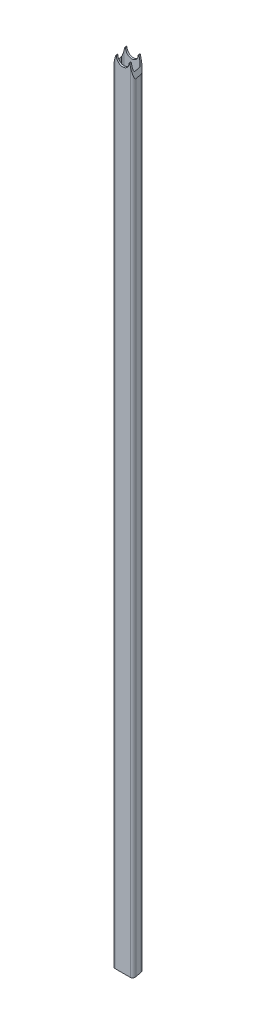
ISO-10303-21;
HEADER;
FILE_DESCRIPTION(('STEP AP214'),'2;1');
FILE_NAME('part.step','',(''),(''),'','','');
FILE_SCHEMA(('AUTOMOTIVE_DESIGN { 1 0 10303 214 1 1 1 1 }'));
ENDSEC;
DATA;
#1=APPLICATION_CONTEXT('core data for automotive mechanical design processes');
#2=APPLICATION_PROTOCOL_DEFINITION('international standard','automotive_design',2000,#1);
#3=PRODUCT_CONTEXT('',#1,'mechanical');
#4=PRODUCT('Part','Part','',(#3));
#5=PRODUCT_RELATED_PRODUCT_CATEGORY('part','',(#4));
#6=PRODUCT_DEFINITION_FORMATION('','',#4);
#7=PRODUCT_DEFINITION_CONTEXT('part definition',#1,'design');
#8=PRODUCT_DEFINITION('design','',#6,#7);
#9=PRODUCT_DEFINITION_SHAPE('','',#8);
#10=(LENGTH_UNIT() NAMED_UNIT(*) SI_UNIT(.MILLI.,.METRE.));
#11=(NAMED_UNIT(*) PLANE_ANGLE_UNIT() SI_UNIT($,.RADIAN.));
#12=(NAMED_UNIT(*) SI_UNIT($,.STERADIAN.) SOLID_ANGLE_UNIT());
#13=UNCERTAINTY_MEASURE_WITH_UNIT(LENGTH_MEASURE(1.E-05),#10,'distance_accuracy_value','');
#14=(GEOMETRIC_REPRESENTATION_CONTEXT(3) GLOBAL_UNCERTAINTY_ASSIGNED_CONTEXT((#13)) GLOBAL_UNIT_ASSIGNED_CONTEXT((#10,
#11,#12)) REPRESENTATION_CONTEXT('',''));
#15=CARTESIAN_POINT('',(0.,0.,0.));
#16=DIRECTION('',(0.,0.,1.));
#17=DIRECTION('',(1.,0.,0.));
#18=AXIS2_PLACEMENT_3D('',#15,#16,#17);
#19=CARTESIAN_POINT('',(0.,1052.42935313821,281.997595264193));
#20=DIRECTION('',(0.,0.96592582628907,0.258819045102522));
#21=DIRECTION('',(0.,-0.258819045102522,0.96592582628907));
#22=AXIS2_PLACEMENT_3D('',#19,#20,#21);
#23=PLANE('',#22);
#24=DIRECTION('',(0.,0.258819045102522,-0.965925826289069));
#25=VECTOR('',#24,1.);
#26=CARTESIAN_POINT('',(9.00000000000001,1119.6472381959,31.1370330515627));
#27=LINE('',#26,#25);
#28=CARTESIAN_POINT('',(9.00000000000201,1129.46410161514,-5.50000000000048));
#29=VERTEX_POINT('',#28);
#30=CARTESIAN_POINT('',(9.00000000000201,1130.,-7.50000000000001));
#31=VERTEX_POINT('',#30);
#32=EDGE_CURVE('E94',#29,#31,#27,.T.);
#33=ORIENTED_EDGE('',*,*,#32,.F.);
#34=DIRECTION('',(-1.,0.,0.));
#35=VECTOR('',#34,1.);
#36=CARTESIAN_POINT('',(-10.999999999998,1129.46410161514,-5.50000000000048));
#37=LINE('',#36,#35);
#38=CARTESIAN_POINT('',(10.000000000002,1129.46410161514,-5.50000000000048));
#39=VERTEX_POINT('',#38);
#40=EDGE_CURVE('E312',#39,#29,#37,.T.);
#41=ORIENTED_EDGE('',*,*,#40,.F.);
#42=DIRECTION('',(0.,-0.258819045102522,0.965925826289069));
#43=VECTOR('',#42,1.);
#44=CARTESIAN_POINT('',(10.,1052.42935313821,281.997595264193));
#45=LINE('',#44,#43);
#46=CARTESIAN_POINT('',(10.000000000002,1130.,-7.50000000000001));
#47=VERTEX_POINT('',#46);
#48=EDGE_CURVE('E289',#47,#39,#45,.T.);
#49=ORIENTED_EDGE('',*,*,#48,.F.);
#50=DIRECTION('',(-1.,0.,0.));
#51=VECTOR('',#50,1.);
#52=CARTESIAN_POINT('',(-10.999999999998,1130.,-7.50000000000001));
#53=LINE('',#52,#51);
#54=EDGE_CURVE('E323',#47,#31,#53,.T.);
#55=ORIENTED_EDGE('',*,*,#54,.T.);
#56=EDGE_LOOP('',(#33,#41,#49,#55));
#57=FACE_BOUND('',#56,.T.);
#58=ADVANCED_FACE('F90',(#57),#23,.T.);
#59=CARTESIAN_POINT('',(9.00000000000201,1125.98076211353,7.50000000000017));
#60=VERTEX_POINT('',#59);
#61=CARTESIAN_POINT('',(9.00000000000201,1126.5166604984,5.50000000000031));
#62=VERTEX_POINT('',#61);
#63=EDGE_CURVE('E13',#60,#62,#27,.T.);
#64=ORIENTED_EDGE('',*,*,#63,.F.);
#65=DIRECTION('',(1.,0.,0.));
#66=VECTOR('',#65,1.);
#67=CARTESIAN_POINT('',(-10.999999999998,1125.98076211353,7.50000000000023));
#68=LINE('',#67,#66);
#69=CARTESIAN_POINT('',(10.000000000002,1125.98076211353,7.50000000000023));
#70=VERTEX_POINT('',#69);
#71=EDGE_CURVE('E443',#60,#70,#68,.T.);
#72=ORIENTED_EDGE('',*,*,#71,.T.);
#73=CARTESIAN_POINT('',(10.000000000002,1126.5166604984,5.50000000000031));
#74=VERTEX_POINT('',#73);
#75=EDGE_CURVE('E288',#74,#70,#45,.T.);
#76=ORIENTED_EDGE('',*,*,#75,.F.);
#77=DIRECTION('',(1.,0.,0.));
#78=VECTOR('',#77,1.);
#79=CARTESIAN_POINT('',(-10.999999999998,1126.5166604984,5.50000000000031));
#80=LINE('',#79,#78);
#81=EDGE_CURVE('E328',#62,#74,#80,.T.);
#82=ORIENTED_EDGE('',*,*,#81,.F.);
#83=EDGE_LOOP('',(#64,#72,#76,#82));
#84=FACE_BOUND('',#83,.T.);
#85=ADVANCED_FACE('F466',(#84),#23,.T.);
#86=DIRECTION('',(0.,0.258819045102522,-0.965925826289069));
#87=VECTOR('',#86,1.);
#88=CARTESIAN_POINT('',(-9.00000000000001,1119.6472381959,31.1370330515627));
#89=LINE('',#88,#87);
#90=CARTESIAN_POINT('',(-8.99999999999801,1130.,-7.50000000000001));
#91=VERTEX_POINT('',#90);
#92=CARTESIAN_POINT('',(-8.99999999999801,1129.46410161514,-5.50000000000048));
#93=VERTEX_POINT('',#92);
#94=EDGE_CURVE('E291',#91,#93,#89,.F.);
#95=ORIENTED_EDGE('',*,*,#94,.F.);
#96=CARTESIAN_POINT('',(-9.99999999999801,1130.,-7.50000000000001));
#97=VERTEX_POINT('',#96);
#98=EDGE_CURVE('E319',#91,#97,#53,.T.);
#99=ORIENTED_EDGE('',*,*,#98,.T.);
#100=DIRECTION('',(0.,0.258819045102522,-0.965925826289069));
#101=VECTOR('',#100,1.);
#102=CARTESIAN_POINT('',(-10.0000000000001,1052.42935313821,281.997595264193));
#103=LINE('',#102,#101);
#104=CARTESIAN_POINT('',(-9.99999999999812,1129.46410161514,-5.50000000000048));
#105=VERTEX_POINT('',#104);
#106=EDGE_CURVE('E279',#105,#97,#103,.T.);
#107=ORIENTED_EDGE('',*,*,#106,.F.);
#108=EDGE_CURVE('E320',#93,#105,#37,.T.);
#109=ORIENTED_EDGE('',*,*,#108,.F.);
#110=EDGE_LOOP('',(#95,#99,#107,#109));
#111=FACE_BOUND('',#110,.T.);
#112=ADVANCED_FACE('F502',(#111),#23,.T.);
#113=CARTESIAN_POINT('',(-15.,1163.5410196625,-3.49999999999956));
#114=DIRECTION('',(1.,0.,0.));
#115=DIRECTION('',(0.,0.,-1.));
#116=AXIS2_PLACEMENT_3D('',#113,#114,#115);
#117=PLANE('',#116);
#118=DIRECTION('',(0.,-1.,0.));
#119=VECTOR('',#118,1.);
#120=CARTESIAN_POINT('',(-15.,1163.5410196625,-3.49999999999956));
#121=LINE('',#120,#119);
#122=CARTESIAN_POINT('',(-14.999999999998,1109.6096867045,-3.49999999999981));
#123=VERTEX_POINT('',#122);
#124=CARTESIAN_POINT('',(-15.,2.94744111674305,-3.49999999999984));
#125=VERTEX_POINT('',#124);
#126=EDGE_CURVE('E349',#123,#125,#121,.T.);
#127=ORIENTED_EDGE('',*,*,#126,.T.);
#128=DIRECTION('',(0.,-0.258819045102518,0.965925826289069));
#129=VECTOR('',#128,1.);
#130=CARTESIAN_POINT('',(-15.,80.6924691447612,-293.648394636436));
#131=LINE('',#130,#129);
#132=CARTESIAN_POINT('',(-15.,1.07179676972524,3.50000000000006));
#133=VERTEX_POINT('',#132);
#134=EDGE_CURVE('E272',#125,#133,#131,.T.);
#135=ORIENTED_EDGE('',*,*,#134,.T.);
#136=DIRECTION('',(0.,-1.,0.));
#137=VECTOR('',#136,1.);
#138=CARTESIAN_POINT('',(-15.,1163.5410196625,3.49999999999967));
#139=LINE('',#138,#137);
#140=CARTESIAN_POINT('',(-14.999999999998,1107.73404235748,3.49999999999973));
#141=VERTEX_POINT('',#140);
#142=EDGE_CURVE('E263',#141,#133,#139,.T.);
#143=ORIENTED_EDGE('',*,*,#142,.F.);
#144=DIRECTION('',(0.,0.258819045102521,-0.965925826289069));
#145=VECTOR('',#144,1.);
#146=CARTESIAN_POINT('',(-14.999999999998,1113.2224009827,-16.9828332395012));
#147=LINE('',#146,#145);
#148=EDGE_CURVE('E404',#141,#123,#147,.T.);
#149=ORIENTED_EDGE('',*,*,#148,.T.);
#150=EDGE_LOOP('',(#127,#135,#143,#149));
#151=FACE_BOUND('',#150,.T.);
#152=ADVANCED_FACE('F515',(#151),#117,.F.);
#153=CARTESIAN_POINT('',(-11.,1163.5410196625,-3.49999999999956));
#154=DIRECTION('',(0.,-1.,0.));
#155=DIRECTION('',(0.,0.,-1.));
#156=AXIS2_PLACEMENT_3D('',#153,#154,#155);
#157=CYLINDRICAL_SURFACE('',#156,4.);
#158=DIRECTION('',(0.,-1.,0.));
#159=VECTOR('',#158,1.);
#160=CARTESIAN_POINT('',(-11.,1163.5410196625,-7.5000000000002));
#161=LINE('',#160,#159);
#162=CARTESIAN_POINT('',(-10.999999999998,1126.13629669484,-7.50000000000001));
#163=VERTEX_POINT('',#162);
#164=CARTESIAN_POINT('',(-11.,4.01923788646674,-7.50000000000001));
#165=VERTEX_POINT('',#164);
#166=EDGE_CURVE('E352',#163,#165,#161,.T.);
#167=ORIENTED_EDGE('',*,*,#166,.T.);
#168=CARTESIAN_POINT('',(-11.,2.94744111674305,-3.49999999999984));
#169=DIRECTION('',(0.,0.965925826289069,0.258819045102518));
#170=DIRECTION('',(0.,-0.258819045102518,0.965925826289069));
#171=AXIS2_PLACEMENT_3D('',#168,#169,#170);
#172=ELLIPSE('',#171,4.14110472164033,4.);
#173=EDGE_CURVE('E533',#165,#125,#172,.T.);
#174=ORIENTED_EDGE('',*,*,#173,.T.);
#175=ORIENTED_EDGE('',*,*,#126,.F.);
#176=CARTESIAN_POINT('',(-10.999999999998,1125.06449992512,-3.49999999999981));
#177=DIRECTION('',(0.965925826289069,-0.249999999999997,-0.0669872981077801));
#178=DIRECTION('',(-0.249400975925943,-0.968245836551858,0.0172960459985907));
#179=AXIS2_PLACEMENT_3D('',#176,#177,#178);
#180=ELLIPSE('',#179,16.0000000000002,4.);
#181=EDGE_CURVE('E401',#123,#163,#180,.T.);
#182=ORIENTED_EDGE('',*,*,#181,.T.);
#183=EDGE_LOOP('',(#167,#174,#175,#182));
#184=FACE_BOUND('',#183,.T.);
#185=ADVANCED_FACE('F520',(#184),#157,.T.);
#186=CARTESIAN_POINT('',(11.,1163.5410196625,-3.49999999999956));
#187=DIRECTION('',(0.,-1.,0.));
#188=DIRECTION('',(0.,0.,-1.));
#189=AXIS2_PLACEMENT_3D('',#186,#187,#188);
#190=CYLINDRICAL_SURFACE('',#189,4.);
#191=DIRECTION('',(0.,-1.,0.));
#192=VECTOR('',#191,1.);
#193=CARTESIAN_POINT('',(15.,1163.5410196625,-3.49999999999956));
#194=LINE('',#193,#192);
#195=CARTESIAN_POINT('',(15.000000000002,1109.6096867045,-3.49999999999981));
#196=VERTEX_POINT('',#195);
#197=CARTESIAN_POINT('',(15.,2.94744111674305,-3.49999999999978));
#198=VERTEX_POINT('',#197);
#199=EDGE_CURVE('E358',#196,#198,#194,.T.);
#200=ORIENTED_EDGE('',*,*,#199,.T.);
#201=CARTESIAN_POINT('',(11.,2.94744111674305,-3.49999999999978));
#202=DIRECTION('',(0.,0.965925826289069,0.258819045102518));
#203=DIRECTION('',(0.,-0.258819045102518,0.965925826289069));
#204=AXIS2_PLACEMENT_3D('',#201,#202,#203);
#205=ELLIPSE('',#204,4.14110472164033,4.);
#206=CARTESIAN_POINT('',(11.,4.01923788646674,-7.50000000000001));
#207=VERTEX_POINT('',#206);
#208=EDGE_CURVE('E378',#198,#207,#205,.T.);
#209=ORIENTED_EDGE('',*,*,#208,.T.);
#210=DIRECTION('',(0.,-1.,0.));
#211=VECTOR('',#210,1.);
#212=CARTESIAN_POINT('',(11.,1163.5410196625,-7.5000000000002));
#213=LINE('',#212,#211);
#214=CARTESIAN_POINT('',(11.000000000002,1126.13629669484,-7.50000000000001));
#215=VERTEX_POINT('',#214);
#216=EDGE_CURVE('E355',#215,#207,#213,.T.);
#217=ORIENTED_EDGE('',*,*,#216,.F.);
#218=CARTESIAN_POINT('',(11.000000000002,1125.06449992512,-3.49999999999981));
#219=DIRECTION('',(-0.965925826289069,-0.249999999999996,-0.0669872981077798));
#220=DIRECTION('',(0.249400975925943,-0.968245836551858,0.0172960459985905));
#221=AXIS2_PLACEMENT_3D('',#218,#219,#220);
#222=ELLIPSE('',#221,16.0000000000002,4.);
#223=EDGE_CURVE('E421',#215,#196,#222,.T.);
#224=ORIENTED_EDGE('',*,*,#223,.T.);
#225=EDGE_LOOP('',(#200,#209,#217,#224));
#226=FACE_BOUND('',#225,.T.);
#227=ADVANCED_FACE('F541',(#226),#190,.T.);
#228=CARTESIAN_POINT('',(15.,1163.5410196625,-3.49999999999956));
#229=DIRECTION('',(-1.,0.,0.));
#230=DIRECTION('',(0.,0.,1.));
#231=AXIS2_PLACEMENT_3D('',#228,#229,#230);
#232=PLANE('',#231);
#233=DIRECTION('',(0.,-1.,0.));
#234=VECTOR('',#233,1.);
#235=CARTESIAN_POINT('',(15.,1163.5410196625,3.49999999999967));
#236=LINE('',#235,#234);
#237=CARTESIAN_POINT('',(15.000000000002,1107.73404235748,3.49999999999973));
#238=VERTEX_POINT('',#237);
#239=CARTESIAN_POINT('',(15.,1.07179676972446,3.49999999999992));
#240=VERTEX_POINT('',#239);
#241=EDGE_CURVE('E284',#238,#240,#236,.T.);
#242=ORIENTED_EDGE('',*,*,#241,.T.);
#243=DIRECTION('',(0.,0.258819045102518,-0.965925826289069));
#244=VECTOR('',#243,1.);
#245=CARTESIAN_POINT('',(14.9999999999999,80.6924691447612,-293.648394636436));
#246=LINE('',#245,#244);
#247=EDGE_CURVE('E367',#240,#198,#246,.T.);
#248=ORIENTED_EDGE('',*,*,#247,.T.);
#249=ORIENTED_EDGE('',*,*,#199,.F.);
#250=DIRECTION('',(0.,-0.258819045102522,0.965925826289069));
#251=VECTOR('',#250,1.);
#252=CARTESIAN_POINT('',(15.000000000002,1113.2224009827,-16.9828332395012));
#253=LINE('',#252,#251);
#254=EDGE_CURVE('E368',#196,#238,#253,.T.);
#255=ORIENTED_EDGE('',*,*,#254,.T.);
#256=EDGE_LOOP('',(#242,#248,#249,#255));
#257=FACE_BOUND('',#256,.T.);
#258=ADVANCED_FACE('F365',(#257),#232,.F.);
#259=CARTESIAN_POINT('',(11.,1163.5410196625,3.49999999999967));
#260=DIRECTION('',(0.,-1.,0.));
#261=DIRECTION('',(0.,0.,-1.));
#262=AXIS2_PLACEMENT_3D('',#259,#260,#261);
#263=CYLINDRICAL_SURFACE('',#262,4.);
#264=DIRECTION('',(0.,-1.,0.));
#265=VECTOR('',#264,1.);
#266=CARTESIAN_POINT('',(11.,1163.5410196625,7.50000000000037));
#267=LINE('',#266,#265);
#268=CARTESIAN_POINT('',(11.000000000002,1122.11705880838,7.50000000000023));
#269=VERTEX_POINT('',#268);
#270=CARTESIAN_POINT('',(11.,0.,7.49999999999951));
#271=VERTEX_POINT('',#270);
#272=EDGE_CURVE('E280',#269,#271,#267,.T.);
#273=ORIENTED_EDGE('',*,*,#272,.T.);
#274=CARTESIAN_POINT('',(11.,1.07179676972524,3.50000000000006));
#275=DIRECTION('',(0.,0.965925826289069,0.258819045102518));
#276=DIRECTION('',(0.,-0.258819045102518,0.965925826289069));
#277=AXIS2_PLACEMENT_3D('',#274,#275,#276);
#278=ELLIPSE('',#277,4.14110472164033,4.);
#279=EDGE_CURVE('E258',#271,#240,#278,.T.);
#280=ORIENTED_EDGE('',*,*,#279,.T.);
#281=ORIENTED_EDGE('',*,*,#241,.F.);
#282=CARTESIAN_POINT('',(11.000000000002,1123.1888555781,3.4999999999997));
#283=DIRECTION('',(-0.965925826289069,-0.249999999999996,-0.0669872981077798));
#284=DIRECTION('',(0.249400975925943,-0.968245836551858,0.0172960459985905));
#285=AXIS2_PLACEMENT_3D('',#282,#283,#284);
#286=ELLIPSE('',#285,16.0000000000002,4.);
#287=EDGE_CURVE('E372',#238,#269,#286,.T.);
#288=ORIENTED_EDGE('',*,*,#287,.T.);
#289=EDGE_LOOP('',(#273,#280,#281,#288));
#290=FACE_BOUND('',#289,.T.);
#291=ADVANCED_FACE('F371',(#290),#263,.T.);
#292=CARTESIAN_POINT('',(-11.,1163.5410196625,7.50000000000037));
#293=DIRECTION('',(0.,0.,-1.));
#294=DIRECTION('',(-1.,0.,0.));
#295=AXIS2_PLACEMENT_3D('',#292,#293,#294);
#296=PLANE('',#295);
#297=ORIENTED_EDGE('',*,*,#71,.F.);
#298=CARTESIAN_POINT('',(1.99840144432528E-12,1125.98076211353,7.50000000000017));
#299=DIRECTION('',(0.,0.,-1.));
#300=DIRECTION('',(0.,1.,0.));
#301=AXIS2_PLACEMENT_3D('',#298,#299,#300);
#302=ELLIPSE('',#301,9.31748562369075,9.);
#303=CARTESIAN_POINT('',(-8.99999999999801,1125.98076211353,7.50000000000017));
#304=VERTEX_POINT('',#303);
#305=EDGE_CURVE('E442',#60,#304,#302,.T.);
#306=ORIENTED_EDGE('',*,*,#305,.T.);
#307=CARTESIAN_POINT('',(-9.99999999999801,1125.98076211353,7.50000000000023));
#308=VERTEX_POINT('',#307);
#309=EDGE_CURVE('E445',#308,#304,#68,.T.);
#310=ORIENTED_EDGE('',*,*,#309,.F.);
#311=DIRECTION('',(-0.250562807085728,-0.968100345886378,0.));
#312=VECTOR('',#311,1.);
#313=CARTESIAN_POINT('',(-0.951792292522291,1160.94035213866,7.50000000000028));
#314=LINE('',#313,#312);
#315=CARTESIAN_POINT('',(-10.999999999998,1122.11705880838,7.50000000000023));
#316=VERTEX_POINT('',#315);
#317=EDGE_CURVE('E278',#308,#316,#314,.T.);
#318=ORIENTED_EDGE('',*,*,#317,.T.);
#319=DIRECTION('',(0.,-1.,0.));
#320=VECTOR('',#319,1.);
#321=CARTESIAN_POINT('',(-11.,1163.5410196625,7.50000000000037));
#322=LINE('',#321,#320);
#323=CARTESIAN_POINT('',(-11.,0.,7.49999999999951));
#324=VERTEX_POINT('',#323);
#325=EDGE_CURVE('E270',#316,#324,#322,.T.);
#326=ORIENTED_EDGE('',*,*,#325,.T.);
#327=DIRECTION('',(1.,0.,0.));
#328=VECTOR('',#327,1.);
#329=CARTESIAN_POINT('',(-11.,0.,7.49999999999951));
#330=LINE('',#329,#328);
#331=EDGE_CURVE('E252',#324,#271,#330,.T.);
#332=ORIENTED_EDGE('',*,*,#331,.T.);
#333=ORIENTED_EDGE('',*,*,#272,.F.);
#334=DIRECTION('',(-0.250562807085728,0.968100345886378,0.));
#335=VECTOR('',#334,1.);
#336=CARTESIAN_POINT('',(-0.42940555396076,1166.27689082319,7.49999999999984));
#337=LINE('',#336,#335);
#338=EDGE_CURVE('E426',#269,#70,#337,.T.);
#339=ORIENTED_EDGE('',*,*,#338,.T.);
#340=EDGE_LOOP('',(#297,#306,#310,#318,#326,#332,#333,#339));
#341=FACE_BOUND('',#340,.T.);
#342=ADVANCED_FACE('F276',(#341),#296,.F.);
#343=CARTESIAN_POINT('',(-11.,1163.5410196625,3.49999999999967));
#344=DIRECTION('',(0.,-1.,0.));
#345=DIRECTION('',(0.,0.,-1.));
#346=AXIS2_PLACEMENT_3D('',#343,#344,#345);
#347=CYLINDRICAL_SURFACE('',#346,4.);
#348=ORIENTED_EDGE('',*,*,#142,.T.);
#349=CARTESIAN_POINT('',(-11.,1.07179676972524,3.50000000000006));
#350=DIRECTION('',(0.,0.965925826289069,0.258819045102518));
#351=DIRECTION('',(0.,-0.258819045102518,0.965925826289069));
#352=AXIS2_PLACEMENT_3D('',#349,#350,#351);
#353=ELLIPSE('',#352,4.14110472164033,4.);
#354=EDGE_CURVE('E255',#133,#324,#353,.T.);
#355=ORIENTED_EDGE('',*,*,#354,.T.);
#356=ORIENTED_EDGE('',*,*,#325,.F.);
#357=CARTESIAN_POINT('',(-10.999999999998,1123.1888555781,3.4999999999997));
#358=DIRECTION('',(0.965925826289069,-0.249999999999997,-0.0669872981077801));
#359=DIRECTION('',(-0.249400975925943,-0.968245836551858,0.0172960459985907));
#360=AXIS2_PLACEMENT_3D('',#357,#358,#359);
#361=ELLIPSE('',#360,16.0000000000002,4.);
#362=EDGE_CURVE('E407',#316,#141,#361,.T.);
#363=ORIENTED_EDGE('',*,*,#362,.T.);
#364=EDGE_LOOP('',(#348,#355,#356,#363));
#365=FACE_BOUND('',#364,.T.);
#366=ADVANCED_FACE('F92',(#365),#347,.T.);
#367=CARTESIAN_POINT('',(-13.,1163.5410196625,-3.49999999999956));
#368=DIRECTION('',(1.,0.,0.));
#369=DIRECTION('',(0.,0.,-1.));
#370=AXIS2_PLACEMENT_3D('',#367,#368,#369);
#371=PLANE('',#370);
#372=DIRECTION('',(0.,-0.258819045102518,0.965925826289069));
#373=VECTOR('',#372,1.);
#374=CARTESIAN_POINT('',(-13.,80.6924691447626,-293.648394636437));
#375=LINE('',#374,#373);
#376=CARTESIAN_POINT('',(-13.,2.94744111674305,-3.49999999999984));
#377=VERTEX_POINT('',#376);
#378=CARTESIAN_POINT('',(-13.,1.07179676972524,3.50000000000006));
#379=VERTEX_POINT('',#378);
#380=EDGE_CURVE('E105',#377,#379,#375,.T.);
#381=ORIENTED_EDGE('',*,*,#380,.F.);
#382=DIRECTION('',(0.,-1.,0.));
#383=VECTOR('',#382,1.);
#384=CARTESIAN_POINT('',(-13.,1163.5410196625,-3.49999999999956));
#385=LINE('',#384,#383);
#386=CARTESIAN_POINT('',(-12.999999999998,1117.33709331481,-3.49999999999981));
#387=VERTEX_POINT('',#386);
#388=EDGE_CURVE('E333',#387,#377,#385,.T.);
#389=ORIENTED_EDGE('',*,*,#388,.F.);
#390=DIRECTION('',(0.,0.25881904510252,-0.965925826289069));
#391=VECTOR('',#390,1.);
#392=CARTESIAN_POINT('',(-12.999999999998,1120.43216950281,-15.0509815869231));
#393=LINE('',#392,#391);
#394=CARTESIAN_POINT('',(-12.999999999998,1115.46144896779,3.49999999999975));
#395=VERTEX_POINT('',#394);
#396=EDGE_CURVE('E414',#395,#387,#393,.T.);
#397=ORIENTED_EDGE('',*,*,#396,.F.);
#398=DIRECTION('',(0.,-1.,0.));
#399=VECTOR('',#398,1.);
#400=CARTESIAN_POINT('',(-13.,1163.5410196625,3.49999999999967));
#401=LINE('',#400,#399);
#402=EDGE_CURVE('E331',#395,#379,#401,.T.);
#403=ORIENTED_EDGE('',*,*,#402,.T.);
#404=EDGE_LOOP('',(#381,#389,#397,#403));
#405=FACE_BOUND('',#404,.T.);
#406=ADVANCED_FACE('F480',(#405),#371,.T.);
#407=CARTESIAN_POINT('',(-11.,1163.5410196625,-3.49999999999956));
#408=DIRECTION('',(0.,-1.,0.));
#409=DIRECTION('',(0.,0.,-1.));
#410=AXIS2_PLACEMENT_3D('',#407,#408,#409);
#411=CYLINDRICAL_SURFACE('',#410,2.);
#412=CARTESIAN_POINT('',(-11.,2.94744111674305,-3.49999999999984));
#413=DIRECTION('',(0.,0.965925826289069,0.258819045102518));
#414=DIRECTION('',(0.,-0.258819045102518,0.965925826289069));
#415=AXIS2_PLACEMENT_3D('',#412,#413,#414);
#416=ELLIPSE('',#415,2.07055236082016,2.);
#417=CARTESIAN_POINT('',(-11.,3.48333950160451,-5.50000000000039));
#418=VERTEX_POINT('',#417);
#419=EDGE_CURVE('E112',#418,#377,#416,.T.);
#420=ORIENTED_EDGE('',*,*,#419,.F.);
#421=DIRECTION('',(0.,-1.,0.));
#422=VECTOR('',#421,1.);
#423=CARTESIAN_POINT('',(-11.,1163.5410196625,-5.50000000000042));
#424=LINE('',#423,#422);
#425=CARTESIAN_POINT('',(-10.999999999998,1125.60039830998,-5.50000000000056));
#426=VERTEX_POINT('',#425);
#427=EDGE_CURVE('E335',#426,#418,#424,.T.);
#428=ORIENTED_EDGE('',*,*,#427,.F.);
#429=CARTESIAN_POINT('',(-10.999999999998,1125.06449992512,-3.49999999999981));
#430=DIRECTION('',(0.965925826289069,-0.249999999999997,-0.0669872981077801));
#431=DIRECTION('',(-0.249400975925943,-0.968245836551858,0.0172960459985907));
#432=AXIS2_PLACEMENT_3D('',#429,#430,#431);
#433=ELLIPSE('',#432,8.00000000000012,2.);
#434=EDGE_CURVE('E416',#387,#426,#433,.T.);
#435=ORIENTED_EDGE('',*,*,#434,.F.);
#436=ORIENTED_EDGE('',*,*,#388,.T.);
#437=EDGE_LOOP('',(#420,#428,#435,#436));
#438=FACE_BOUND('',#437,.T.);
#439=ADVANCED_FACE('F481',(#438),#411,.F.);
#440=CARTESIAN_POINT('',(-11.,1163.5410196625,-5.50000000000042));
#441=DIRECTION('',(0.,0.,1.));
#442=DIRECTION('',(1.,0.,0.));
#443=AXIS2_PLACEMENT_3D('',#440,#441,#442);
#444=PLANE('',#443);
#445=DIRECTION('',(-1.,0.,0.));
#446=VECTOR('',#445,1.);
#447=CARTESIAN_POINT('',(-11.,3.48333950160451,-5.50000000000039));
#448=LINE('',#447,#446);
#449=CARTESIAN_POINT('',(11.,3.48333950160451,-5.50000000000039));
#450=VERTEX_POINT('',#449);
#451=EDGE_CURVE('E393',#450,#418,#448,.T.);
#452=ORIENTED_EDGE('',*,*,#451,.F.);
#453=DIRECTION('',(0.,-1.,0.));
#454=VECTOR('',#453,1.);
#455=CARTESIAN_POINT('',(11.,1163.5410196625,-5.50000000000042));
#456=LINE('',#455,#454);
#457=CARTESIAN_POINT('',(11.000000000002,1125.60039830998,-5.50000000000056));
#458=VERTEX_POINT('',#457);
#459=EDGE_CURVE('E314',#458,#450,#456,.T.);
#460=ORIENTED_EDGE('',*,*,#459,.F.);
#461=DIRECTION('',(0.250562807085728,-0.968100345886378,0.));
#462=VECTOR('',#461,1.);
#463=CARTESIAN_POINT('',(0.415547900660562,1166.49558086947,-5.5000000000005));
#464=LINE('',#463,#462);
#465=EDGE_CURVE('E299',#39,#458,#464,.T.);
#466=ORIENTED_EDGE('',*,*,#465,.F.);
#467=ORIENTED_EDGE('',*,*,#40,.T.);
#468=CARTESIAN_POINT('',(1.99840144432528E-12,1129.46410161514,-5.50000000000048));
#469=DIRECTION('',(0.,0.,1.));
#470=DIRECTION('',(0.,1.,0.));
#471=AXIS2_PLACEMENT_3D('',#468,#469,#470);
#472=ELLIPSE('',#471,9.31748562369075,9.);
#473=EDGE_CURVE('E440',#93,#29,#472,.T.);
#474=ORIENTED_EDGE('',*,*,#473,.F.);
#475=ORIENTED_EDGE('',*,*,#108,.T.);
#476=DIRECTION('',(0.250562807085728,0.968100345886378,0.));
#477=VECTOR('',#476,1.);
#478=CARTESIAN_POINT('',(-1.7967457471435,1161.15904218494,-5.50000000000042));
#479=LINE('',#478,#477);
#480=EDGE_CURVE('E418',#426,#105,#479,.T.);
#481=ORIENTED_EDGE('',*,*,#480,.F.);
#482=ORIENTED_EDGE('',*,*,#427,.T.);
#483=EDGE_LOOP('',(#452,#460,#466,#467,#474,#475,#481,#482));
#484=FACE_BOUND('',#483,.T.);
#485=ADVANCED_FACE('F310',(#484),#444,.T.);
#486=CARTESIAN_POINT('',(11.,1163.5410196625,-3.49999999999956));
#487=DIRECTION('',(0.,-1.,0.));
#488=DIRECTION('',(0.,0.,-1.));
#489=AXIS2_PLACEMENT_3D('',#486,#487,#488);
#490=CYLINDRICAL_SURFACE('',#489,2.);
#491=CARTESIAN_POINT('',(11.,2.94744111674305,-3.49999999999978));
#492=DIRECTION('',(0.,0.965925826289069,0.258819045102518));
#493=DIRECTION('',(0.,-0.258819045102518,0.965925826289069));
#494=AXIS2_PLACEMENT_3D('',#491,#492,#493);
#495=ELLIPSE('',#494,2.07055236082016,2.);
#496=CARTESIAN_POINT('',(13.,2.94744111674305,-3.49999999999978));
#497=VERTEX_POINT('',#496);
#498=EDGE_CURVE('E390',#497,#450,#495,.T.);
#499=ORIENTED_EDGE('',*,*,#498,.F.);
#500=DIRECTION('',(0.,-1.,0.));
#501=VECTOR('',#500,1.);
#502=CARTESIAN_POINT('',(13.,1163.5410196625,-3.49999999999956));
#503=LINE('',#502,#501);
#504=CARTESIAN_POINT('',(13.000000000002,1117.33709331481,-3.49999999999981));
#505=VERTEX_POINT('',#504);
#506=EDGE_CURVE('E338',#505,#497,#503,.T.);
#507=ORIENTED_EDGE('',*,*,#506,.F.);
#508=CARTESIAN_POINT('',(11.000000000002,1125.06449992512,-3.49999999999981));
#509=DIRECTION('',(-0.965925826289069,-0.249999999999996,-0.0669872981077798));
#510=DIRECTION('',(0.249400975925943,-0.968245836551858,0.0172960459985905));
#511=AXIS2_PLACEMENT_3D('',#508,#509,#510);
#512=ELLIPSE('',#511,8.00000000000012,2.);
#513=EDGE_CURVE('E316',#458,#505,#512,.T.);
#514=ORIENTED_EDGE('',*,*,#513,.F.);
#515=ORIENTED_EDGE('',*,*,#459,.T.);
#516=EDGE_LOOP('',(#499,#507,#514,#515));
#517=FACE_BOUND('',#516,.T.);
#518=ADVANCED_FACE('F484',(#517),#490,.F.);
#519=CARTESIAN_POINT('',(13.,1163.5410196625,-3.49999999999956));
#520=DIRECTION('',(-1.,0.,0.));
#521=DIRECTION('',(0.,0.,1.));
#522=AXIS2_PLACEMENT_3D('',#519,#520,#521);
#523=PLANE('',#522);
#524=DIRECTION('',(0.,0.258819045102518,-0.965925826289069));
#525=VECTOR('',#524,1.);
#526=CARTESIAN_POINT('',(12.9999999999999,80.6924691447626,-293.648394636437));
#527=LINE('',#526,#525);
#528=CARTESIAN_POINT('',(13.,1.07179676972524,3.50000000000006));
#529=VERTEX_POINT('',#528);
#530=EDGE_CURVE('E387',#529,#497,#527,.T.);
#531=ORIENTED_EDGE('',*,*,#530,.F.);
#532=DIRECTION('',(0.,-1.,0.));
#533=VECTOR('',#532,1.);
#534=CARTESIAN_POINT('',(13.,1163.5410196625,3.49999999999967));
#535=LINE('',#534,#533);
#536=CARTESIAN_POINT('',(13.000000000002,1115.46144896779,3.49999999999975));
#537=VERTEX_POINT('',#536);
#538=EDGE_CURVE('E341',#537,#529,#535,.T.);
#539=ORIENTED_EDGE('',*,*,#538,.F.);
#540=DIRECTION('',(0.,-0.258819045102522,0.965925826289069));
#541=VECTOR('',#540,1.);
#542=CARTESIAN_POINT('',(13.000000000002,1120.43216950281,-15.0509815869231));
#543=LINE('',#542,#541);
#544=EDGE_CURVE('E433',#505,#537,#543,.T.);
#545=ORIENTED_EDGE('',*,*,#544,.F.);
#546=ORIENTED_EDGE('',*,*,#506,.T.);
#547=EDGE_LOOP('',(#531,#539,#545,#546));
#548=FACE_BOUND('',#547,.T.);
#549=ADVANCED_FACE('F488',(#548),#523,.T.);
#550=CARTESIAN_POINT('',(11.,1163.5410196625,3.49999999999967));
#551=DIRECTION('',(0.,-1.,0.));
#552=DIRECTION('',(0.,0.,-1.));
#553=AXIS2_PLACEMENT_3D('',#550,#551,#552);
#554=CYLINDRICAL_SURFACE('',#553,2.);
#555=CARTESIAN_POINT('',(11.,1.07179676972524,3.50000000000006));
#556=DIRECTION('',(0.,0.965925826289069,0.258819045102518));
#557=DIRECTION('',(0.,-0.258819045102518,0.965925826289069));
#558=AXIS2_PLACEMENT_3D('',#555,#556,#557);
#559=ELLIPSE('',#558,2.07055236082016,2.);
#560=CARTESIAN_POINT('',(11.,0.535898384863009,5.49999999999989));
#561=VERTEX_POINT('',#560);
#562=EDGE_CURVE('E384',#561,#529,#559,.T.);
#563=ORIENTED_EDGE('',*,*,#562,.F.);
#564=DIRECTION('',(0.,-1.,0.));
#565=VECTOR('',#564,1.);
#566=CARTESIAN_POINT('',(11.,1163.5410196625,5.50000000000062));
#567=LINE('',#566,#565);
#568=CARTESIAN_POINT('',(11.000000000002,1122.65295719324,5.50000000000023));
#569=VERTEX_POINT('',#568);
#570=EDGE_CURVE('E344',#569,#561,#567,.T.);
#571=ORIENTED_EDGE('',*,*,#570,.F.);
#572=CARTESIAN_POINT('',(11.000000000002,1123.1888555781,3.4999999999997));
#573=DIRECTION('',(-0.965925826289069,-0.249999999999996,-0.0669872981077798));
#574=DIRECTION('',(0.249400975925943,-0.968245836551858,0.0172960459985905));
#575=AXIS2_PLACEMENT_3D('',#572,#573,#574);
#576=ELLIPSE('',#575,8.00000000000012,2.);
#577=EDGE_CURVE('E431',#537,#569,#576,.T.);
#578=ORIENTED_EDGE('',*,*,#577,.F.);
#579=ORIENTED_EDGE('',*,*,#538,.T.);
#580=EDGE_LOOP('',(#563,#571,#578,#579));
#581=FACE_BOUND('',#580,.T.);
#582=ADVANCED_FACE('F470',(#581),#554,.F.);
#583=CARTESIAN_POINT('',(-11.,1163.5410196625,5.50000000000062));
#584=DIRECTION('',(0.,0.,-1.));
#585=DIRECTION('',(-1.,0.,0.));
#586=AXIS2_PLACEMENT_3D('',#583,#584,#585);
#587=PLANE('',#586);
#588=DIRECTION('',(1.,0.,0.));
#589=VECTOR('',#588,1.);
#590=CARTESIAN_POINT('',(-11.,0.535898384863231,5.49999999999978));
#591=LINE('',#590,#589);
#592=CARTESIAN_POINT('',(-11.,0.535898384863231,5.49999999999978));
#593=VERTEX_POINT('',#592);
#594=EDGE_CURVE('E376',#593,#561,#591,.T.);
#595=ORIENTED_EDGE('',*,*,#594,.F.);
#596=DIRECTION('',(0.,-1.,0.));
#597=VECTOR('',#596,1.);
#598=CARTESIAN_POINT('',(-11.,1163.5410196625,5.50000000000062));
#599=LINE('',#598,#597);
#600=CARTESIAN_POINT('',(-10.999999999998,1122.65295719324,5.50000000000023));
#601=VERTEX_POINT('',#600);
#602=EDGE_CURVE('E264',#601,#593,#599,.T.);
#603=ORIENTED_EDGE('',*,*,#602,.F.);
#604=DIRECTION('',(-0.250562807085728,-0.968100345886378,0.));
#605=VECTOR('',#604,1.);
#606=CARTESIAN_POINT('',(-1.08178513169477,1160.97399676116,5.50000000000045));
#607=LINE('',#606,#605);
#608=CARTESIAN_POINT('',(-9.99999999999801,1126.5166604984,5.50000000000031));
#609=VERTEX_POINT('',#608);
#610=EDGE_CURVE('E412',#609,#601,#607,.T.);
#611=ORIENTED_EDGE('',*,*,#610,.F.);
#612=CARTESIAN_POINT('',(-8.99999999999801,1126.5166604984,5.50000000000031));
#613=VERTEX_POINT('',#612);
#614=EDGE_CURVE('E326',#609,#613,#80,.T.);
#615=ORIENTED_EDGE('',*,*,#614,.T.);
#616=CARTESIAN_POINT('',(1.99840144432528E-12,1126.5166604984,5.50000000000031));
#617=DIRECTION('',(0.,0.,-1.));
#618=DIRECTION('',(0.,1.,0.));
#619=AXIS2_PLACEMENT_3D('',#616,#617,#618);
#620=ELLIPSE('',#619,9.31748562369075,9.);
#621=EDGE_CURVE('E438',#62,#613,#620,.T.);
#622=ORIENTED_EDGE('',*,*,#621,.F.);
#623=ORIENTED_EDGE('',*,*,#81,.T.);
#624=DIRECTION('',(-0.250562807085728,0.968100345886378,0.));
#625=VECTOR('',#624,1.);
#626=CARTESIAN_POINT('',(-0.299412714788283,1166.3105354457,5.50000000000059));
#627=LINE('',#626,#625);
#628=EDGE_CURVE('E429',#569,#74,#627,.T.);
#629=ORIENTED_EDGE('',*,*,#628,.F.);
#630=ORIENTED_EDGE('',*,*,#570,.T.);
#631=EDGE_LOOP('',(#595,#603,#611,#615,#622,#623,#629,#630));
#632=FACE_BOUND('',#631,.T.);
#633=ADVANCED_FACE('F461',(#632),#587,.T.);
#634=CARTESIAN_POINT('',(-11.,1163.5410196625,3.49999999999967));
#635=DIRECTION('',(0.,-1.,0.));
#636=DIRECTION('',(0.,0.,-1.));
#637=AXIS2_PLACEMENT_3D('',#634,#635,#636);
#638=CYLINDRICAL_SURFACE('',#637,2.);
#639=CARTESIAN_POINT('',(-11.,1.07179676972524,3.50000000000006));
#640=DIRECTION('',(0.,0.965925826289069,0.258819045102518));
#641=DIRECTION('',(0.,-0.258819045102518,0.965925826289069));
#642=AXIS2_PLACEMENT_3D('',#639,#640,#641);
#643=ELLIPSE('',#642,2.07055236082016,2.);
#644=EDGE_CURVE('E373',#379,#593,#643,.T.);
#645=ORIENTED_EDGE('',*,*,#644,.F.);
#646=ORIENTED_EDGE('',*,*,#402,.F.);
#647=CARTESIAN_POINT('',(-10.999999999998,1123.1888555781,3.4999999999997));
#648=DIRECTION('',(0.965925826289069,-0.249999999999997,-0.0669872981077801));
#649=DIRECTION('',(-0.249400975925943,-0.968245836551858,0.0172960459985907));
#650=AXIS2_PLACEMENT_3D('',#647,#648,#649);
#651=ELLIPSE('',#650,8.00000000000012,2.);
#652=EDGE_CURVE('E410',#601,#395,#651,.T.);
#653=ORIENTED_EDGE('',*,*,#652,.F.);
#654=ORIENTED_EDGE('',*,*,#602,.T.);
#655=EDGE_LOOP('',(#645,#646,#653,#654));
#656=FACE_BOUND('',#655,.T.);
#657=ADVANCED_FACE('F475',(#656),#638,.F.);
#658=CARTESIAN_POINT('',(-11.,1163.5410196625,-7.5000000000002));
#659=DIRECTION('',(0.,0.,1.));
#660=DIRECTION('',(1.,0.,0.));
#661=AXIS2_PLACEMENT_3D('',#658,#659,#660);
#662=PLANE('',#661);
#663=ORIENTED_EDGE('',*,*,#216,.T.);
#664=DIRECTION('',(-1.,0.,0.));
#665=VECTOR('',#664,1.);
#666=CARTESIAN_POINT('',(-11.,4.01923788646674,-7.50000000000001));
#667=LINE('',#666,#665);
#668=EDGE_CURVE('E535',#207,#165,#667,.T.);
#669=ORIENTED_EDGE('',*,*,#668,.T.);
#670=ORIENTED_EDGE('',*,*,#166,.F.);
#671=DIRECTION('',(0.250562807085728,0.968100345886378,0.));
#672=VECTOR('',#671,1.);
#673=CARTESIAN_POINT('',(-1.92673858631598,1161.19268680744,-7.50000000000034));
#674=LINE('',#673,#672);
#675=EDGE_CURVE('E398',#163,#97,#674,.T.);
#676=ORIENTED_EDGE('',*,*,#675,.T.);
#677=ORIENTED_EDGE('',*,*,#98,.F.);
#678=CARTESIAN_POINT('',(1.99840144432528E-12,1130.,-7.50000000000001));
#679=DIRECTION('',(0.,0.,1.));
#680=DIRECTION('',(0.,1.,0.));
#681=AXIS2_PLACEMENT_3D('',#678,#679,#680);
#682=ELLIPSE('',#681,9.31748562369075,9.);
#683=EDGE_CURVE('E315',#91,#31,#682,.T.);
#684=ORIENTED_EDGE('',*,*,#683,.T.);
#685=ORIENTED_EDGE('',*,*,#54,.F.);
#686=DIRECTION('',(0.250562807085728,-0.968100345886378,0.));
#687=VECTOR('',#686,1.);
#688=CARTESIAN_POINT('',(0.545540739833039,1166.52922549197,-7.50000000000037));
#689=LINE('',#688,#687);
#690=EDGE_CURVE('E302',#47,#215,#689,.T.);
#691=ORIENTED_EDGE('',*,*,#690,.T.);
#692=EDGE_LOOP('',(#663,#669,#670,#676,#677,#684,#685,#691));
#693=FACE_BOUND('',#692,.T.);
#694=ADVANCED_FACE('F506',(#693),#662,.F.);
#695=EDGE_CURVE('E290',#613,#304,#89,.F.);
#696=ORIENTED_EDGE('',*,*,#695,.F.);
#697=ORIENTED_EDGE('',*,*,#614,.F.);
#698=EDGE_CURVE('E282',#308,#609,#103,.T.);
#699=ORIENTED_EDGE('',*,*,#698,.F.);
#700=ORIENTED_EDGE('',*,*,#309,.T.);
#701=EDGE_LOOP('',(#696,#697,#699,#700));
#702=FACE_BOUND('',#701,.T.);
#703=ADVANCED_FACE('F463',(#702),#23,.T.);
#704=CARTESIAN_POINT('',(-19.999999999998,1083.59839559536,21.4777747886721));
#705=DIRECTION('',(0.965925826289069,-0.249999999999997,-0.0669872981077801));
#706=DIRECTION('',(0.250562807085728,0.968100345886378,0.));
#707=AXIS2_PLACEMENT_3D('',#704,#705,#706);
#708=PLANE('',#707);
#709=ORIENTED_EDGE('',*,*,#480,.T.);
#710=ORIENTED_EDGE('',*,*,#106,.T.);
#711=ORIENTED_EDGE('',*,*,#675,.F.);
#712=ORIENTED_EDGE('',*,*,#181,.F.);
#713=ORIENTED_EDGE('',*,*,#148,.F.);
#714=ORIENTED_EDGE('',*,*,#362,.F.);
#715=ORIENTED_EDGE('',*,*,#317,.F.);
#716=ORIENTED_EDGE('',*,*,#698,.T.);
#717=ORIENTED_EDGE('',*,*,#610,.T.);
#718=ORIENTED_EDGE('',*,*,#652,.T.);
#719=ORIENTED_EDGE('',*,*,#396,.T.);
#720=ORIENTED_EDGE('',*,*,#434,.T.);
#721=EDGE_LOOP('',(#709,#710,#711,#712,#713,#714,#715,#716,#717,#718,#719,#720));
#722=FACE_BOUND('',#721,.T.);
#723=ADVANCED_FACE('F478',(#722),#708,.F.);
#724=CARTESIAN_POINT('',(10.,1119.6472381959,31.1370330515627));
#725=DIRECTION('',(-0.965925826289069,-0.249999999999996,-0.0669872981077798));
#726=DIRECTION('',(0.250562807085728,-0.968100345886378,0.));
#727=AXIS2_PLACEMENT_3D('',#724,#725,#726);
#728=PLANE('',#727);
#729=ORIENTED_EDGE('',*,*,#465,.T.);
#730=ORIENTED_EDGE('',*,*,#513,.T.);
#731=ORIENTED_EDGE('',*,*,#544,.T.);
#732=ORIENTED_EDGE('',*,*,#577,.T.);
#733=ORIENTED_EDGE('',*,*,#628,.T.);
#734=ORIENTED_EDGE('',*,*,#75,.T.);
#735=ORIENTED_EDGE('',*,*,#338,.F.);
#736=ORIENTED_EDGE('',*,*,#287,.F.);
#737=ORIENTED_EDGE('',*,*,#254,.F.);
#738=ORIENTED_EDGE('',*,*,#223,.F.);
#739=ORIENTED_EDGE('',*,*,#690,.F.);
#740=ORIENTED_EDGE('',*,*,#48,.T.);
#741=EDGE_LOOP('',(#729,#730,#731,#732,#733,#734,#735,#736,#737,#738,#739,#740));
#742=FACE_BOUND('',#741,.T.);
#743=ADVANCED_FACE('F298',(#742),#728,.F.);
#744=CARTESIAN_POINT('',(0.,1119.6472381959,31.1370330515627));
#745=DIRECTION('',(0.,0.258819045102522,-0.965925826289069));
#746=DIRECTION('',(0.,0.965925826289069,0.258819045102522));
#747=AXIS2_PLACEMENT_3D('',#744,#745,#746);
#748=CYLINDRICAL_SURFACE('',#747,9.);
#749=ORIENTED_EDGE('',*,*,#63,.T.);
#750=ORIENTED_EDGE('',*,*,#621,.T.);
#751=ORIENTED_EDGE('',*,*,#695,.T.);
#752=ORIENTED_EDGE('',*,*,#305,.F.);
#753=EDGE_LOOP('',(#749,#750,#751,#752));
#754=FACE_BOUND('',#753,.T.);
#755=ADVANCED_FACE('F465',(#754),#748,.F.);
#756=ORIENTED_EDGE('',*,*,#473,.T.);
#757=ORIENTED_EDGE('',*,*,#32,.T.);
#758=ORIENTED_EDGE('',*,*,#683,.F.);
#759=ORIENTED_EDGE('',*,*,#94,.T.);
#760=EDGE_LOOP('',(#756,#757,#758,#759));
#761=FACE_BOUND('',#760,.T.);
#762=ADVANCED_FACE('F648',(#761),#748,.F.);
#763=CARTESIAN_POINT('',(0.,1.87500000000074,0.502404735808371));
#764=DIRECTION('',(0.,0.965925826289069,0.258819045102518));
#765=DIRECTION('',(0.,-0.258819045102518,0.965925826289069));
#766=AXIS2_PLACEMENT_3D('',#763,#764,#765);
#767=PLANE('',#766);
#768=ORIENTED_EDGE('',*,*,#419,.T.);
#769=ORIENTED_EDGE('',*,*,#380,.T.);
#770=ORIENTED_EDGE('',*,*,#644,.T.);
#771=ORIENTED_EDGE('',*,*,#594,.T.);
#772=ORIENTED_EDGE('',*,*,#562,.T.);
#773=ORIENTED_EDGE('',*,*,#530,.T.);
#774=ORIENTED_EDGE('',*,*,#498,.T.);
#775=ORIENTED_EDGE('',*,*,#451,.T.);
#776=EDGE_LOOP('',(#768,#769,#770,#771,#772,#773,#774,#775));
#777=FACE_BOUND('',#776,.T.);
#778=ORIENTED_EDGE('',*,*,#279,.F.);
#779=ORIENTED_EDGE('',*,*,#331,.F.);
#780=ORIENTED_EDGE('',*,*,#354,.F.);
#781=ORIENTED_EDGE('',*,*,#134,.F.);
#782=ORIENTED_EDGE('',*,*,#173,.F.);
#783=ORIENTED_EDGE('',*,*,#668,.F.);
#784=ORIENTED_EDGE('',*,*,#208,.F.);
#785=ORIENTED_EDGE('',*,*,#247,.F.);
#786=EDGE_LOOP('',(#778,#779,#780,#781,#782,#783,#784,#785));
#787=FACE_BOUND('',#786,.T.);
#788=ADVANCED_FACE('F254',(#777,#787),#767,.F.);
#789=CLOSED_SHELL('',(#58,#85,#112,#152,#185,#227,#258,#291,#342,#366,#406,#439,#485,#518,#549,
#582,#633,#657,#694,#703,#723,#743,#755,#762,#788));
#790=MANIFOLD_SOLID_BREP('B2',#789);
#791=ADVANCED_BREP_SHAPE_REPRESENTATION('',(#18,#790),#14);
#792=SHAPE_DEFINITION_REPRESENTATION(#9,#791);
ENDSEC;
END-ISO-10303-21;
